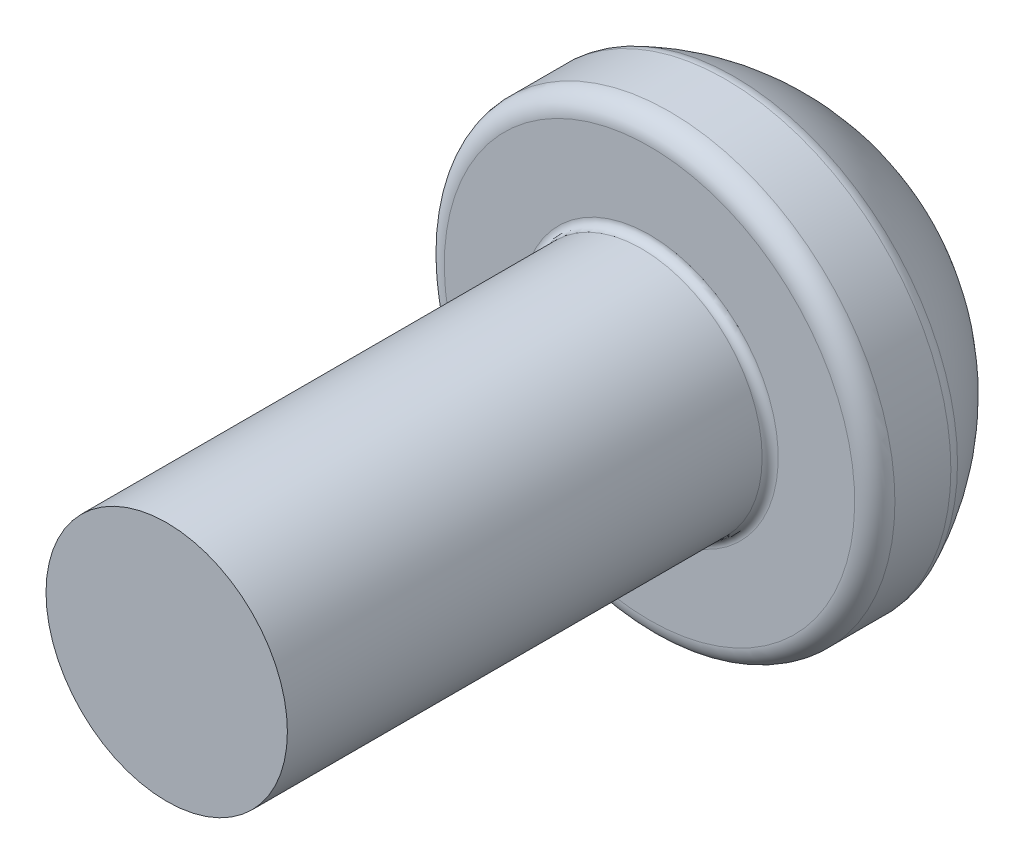
ISO-10303-21;
HEADER;
FILE_DESCRIPTION(('STEP AP214'),'2;1');
FILE_NAME('part.step','',(''),(''),'','','');
FILE_SCHEMA(('AUTOMOTIVE_DESIGN { 1 0 10303 214 1 1 1 1 }'));
ENDSEC;
DATA;
#1=APPLICATION_CONTEXT('core data for automotive mechanical design processes');
#2=APPLICATION_PROTOCOL_DEFINITION('international standard','automotive_design',2000,#1);
#3=PRODUCT_CONTEXT('',#1,'mechanical');
#4=PRODUCT('Part','Part','',(#3));
#5=PRODUCT_RELATED_PRODUCT_CATEGORY('part','',(#4));
#6=PRODUCT_DEFINITION_FORMATION('','',#4);
#7=PRODUCT_DEFINITION_CONTEXT('part definition',#1,'design');
#8=PRODUCT_DEFINITION('design','',#6,#7);
#9=PRODUCT_DEFINITION_SHAPE('','',#8);
#10=(LENGTH_UNIT() NAMED_UNIT(*) SI_UNIT(.MILLI.,.METRE.));
#11=(NAMED_UNIT(*) PLANE_ANGLE_UNIT() SI_UNIT($,.RADIAN.));
#12=(NAMED_UNIT(*) SI_UNIT($,.STERADIAN.) SOLID_ANGLE_UNIT());
#13=UNCERTAINTY_MEASURE_WITH_UNIT(LENGTH_MEASURE(1.E-05),#10,'distance_accuracy_value','');
#14=(GEOMETRIC_REPRESENTATION_CONTEXT(3) GLOBAL_UNCERTAINTY_ASSIGNED_CONTEXT((#13)) GLOBAL_UNIT_ASSIGNED_CONTEXT((#10,
#11,#12)) REPRESENTATION_CONTEXT('',''));
#15=CARTESIAN_POINT('',(0.,0.,0.));
#16=DIRECTION('',(0.,0.,1.));
#17=DIRECTION('',(1.,0.,0.));
#18=AXIS2_PLACEMENT_3D('',#15,#16,#17);
#19=CARTESIAN_POINT('',(0.,0.,6.));
#20=DIRECTION('',(0.,0.,1.));
#21=DIRECTION('',(0.,-1.,0.));
#22=AXIS2_PLACEMENT_3D('',#19,#20,#21);
#23=PLANE('',#22);
#24=CARTESIAN_POINT('',(0.,0.,6.));
#25=DIRECTION('',(0.,0.,-1.));
#26=DIRECTION('',(0.,1.,0.));
#27=AXIS2_PLACEMENT_3D('',#24,#25,#26);
#28=CIRCLE('',#27,1.5);
#29=CARTESIAN_POINT('',(0.,1.5,6.));
#30=VERTEX_POINT('',#29);
#31=EDGE_CURVE('E266',#30,#30,#28,.T.);
#32=ORIENTED_EDGE('',*,*,#31,.F.);
#33=EDGE_LOOP('',(#32));
#34=FACE_BOUND('',#33,.T.);
#35=ADVANCED_FACE('F34',(#34),#23,.T.);
#36=CARTESIAN_POINT('',(0.,0.,-2.4));
#37=DIRECTION('',(0.,0.,-1.));
#38=DIRECTION('',(0.,1.,0.));
#39=AXIS2_PLACEMENT_3D('',#36,#37,#38);
#40=CYLINDRICAL_SURFACE('',#39,1.5);
#41=CARTESIAN_POINT('',(0.,0.,0.0999999999999998));
#42=DIRECTION('',(0.,0.,1.));
#43=DIRECTION('',(0.,-1.,0.));
#44=AXIS2_PLACEMENT_3D('',#41,#42,#43);
#45=CIRCLE('',#44,1.5);
#46=CARTESIAN_POINT('',(0.,-1.5,0.0999999999999996));
#47=VERTEX_POINT('',#46);
#48=EDGE_CURVE('E272',#47,#47,#45,.T.);
#49=ORIENTED_EDGE('',*,*,#48,.T.);
#50=EDGE_LOOP('',(#49));
#51=FACE_BOUND('',#50,.T.);
#52=ORIENTED_EDGE('',*,*,#31,.T.);
#53=EDGE_LOOP('',(#52));
#54=FACE_BOUND('',#53,.T.);
#55=ADVANCED_FACE('F307',(#51,#54),#40,.T.);
#56=CARTESIAN_POINT('',(0.,1.5,0.));
#57=DIRECTION('',(0.,0.,1.));
#58=DIRECTION('',(0.,-1.,0.));
#59=AXIS2_PLACEMENT_3D('',#56,#57,#58);
#60=PLANE('',#59);
#61=CARTESIAN_POINT('',(0.,0.,0.));
#62=DIRECTION('',(0.,0.,1.));
#63=DIRECTION('',(0.,-1.,0.));
#64=AXIS2_PLACEMENT_3D('',#61,#62,#63);
#65=CIRCLE('',#64,2.55);
#66=CARTESIAN_POINT('',(0.,-2.55,0.));
#67=VERTEX_POINT('',#66);
#68=EDGE_CURVE('E11',#67,#67,#65,.T.);
#69=ORIENTED_EDGE('',*,*,#68,.T.);
#70=EDGE_LOOP('',(#69));
#71=FACE_BOUND('',#70,.T.);
#72=CARTESIAN_POINT('',(0.,0.,0.));
#73=DIRECTION('',(0.,0.,1.));
#74=DIRECTION('',(0.,-1.,0.));
#75=AXIS2_PLACEMENT_3D('',#72,#73,#74);
#76=CIRCLE('',#75,1.6);
#77=CARTESIAN_POINT('',(0.,-1.6,0.));
#78=VERTEX_POINT('',#77);
#79=EDGE_CURVE('E269',#78,#78,#76,.F.);
#80=ORIENTED_EDGE('',*,*,#79,.T.);
#81=EDGE_LOOP('',(#80));
#82=FACE_BOUND('',#81,.T.);
#83=ADVANCED_FACE('F312',(#71,#82),#60,.T.);
#84=CARTESIAN_POINT('',(0.,0.,-2.4));
#85=DIRECTION('',(0.,0.,-1.));
#86=DIRECTION('',(0.,1.,0.));
#87=AXIS2_PLACEMENT_3D('',#84,#85,#86);
#88=CYLINDRICAL_SURFACE('',#87,2.8);
#89=CARTESIAN_POINT('',(0.,0.,-0.945424841825026));
#90=DIRECTION('',(0.,0.,1.));
#91=DIRECTION('',(0.,-1.,0.));
#92=AXIS2_PLACEMENT_3D('',#89,#90,#91);
#93=CIRCLE('',#92,2.8);
#94=CARTESIAN_POINT('',(0.,-2.8,-0.945424841825027));
#95=VERTEX_POINT('',#94);
#96=EDGE_CURVE('E41',#95,#95,#93,.T.);
#97=ORIENTED_EDGE('',*,*,#96,.T.);
#98=EDGE_LOOP('',(#97));
#99=FACE_BOUND('',#98,.T.);
#100=CARTESIAN_POINT('',(0.,0.,-0.25));
#101=DIRECTION('',(0.,0.,1.));
#102=DIRECTION('',(0.,-1.,0.));
#103=AXIS2_PLACEMENT_3D('',#100,#101,#102);
#104=CIRCLE('',#103,2.8);
#105=CARTESIAN_POINT('',(0.,-2.8,-0.250000000000001));
#106=VERTEX_POINT('',#105);
#107=EDGE_CURVE('E278',#106,#106,#104,.F.);
#108=ORIENTED_EDGE('',*,*,#107,.T.);
#109=EDGE_LOOP('',(#108));
#110=FACE_BOUND('',#109,.T.);
#111=ADVANCED_FACE('F283',(#99,#110),#88,.T.);
#112=CARTESIAN_POINT('',(0.,0.,0.253));
#113=DIRECTION('',(0.,0.,-1.));
#114=DIRECTION('',(0.,1.,0.));
#115=AXIS2_PLACEMENT_3D('',#112,#113,#114);
#116=SPHERICAL_SURFACE('',#115,3.06757379699332);
#117=CARTESIAN_POINT('',(0.,0.,-1.05175966463463));
#118=DIRECTION('',(0.,0.,1.));
#119=DIRECTION('',(0.,-1.,0.));
#120=AXIS2_PLACEMENT_3D('',#117,#118,#119);
#121=CIRCLE('',#120,2.77625849256559);
#122=CARTESIAN_POINT('',(0.,2.77625849256559,-1.05175966463463));
#123=VERTEX_POINT('',#122);
#124=EDGE_CURVE('E275',#123,#123,#121,.F.);
#125=CARTESIAN_POINT('',(0.,0.,-2.4));
#126=DIRECTION('',(0.,0.,-1.));
#127=DIRECTION('',(0.,1.,0.));
#128=AXIS2_PLACEMENT_3D('',#125,#126,#127);
#129=CIRCLE('',#128,1.54);
#130=CARTESIAN_POINT('',(0.,1.54,-2.4));
#131=VERTEX_POINT('',#130);
#132=EDGE_CURVE('E262',#131,#131,#129,.T.);
#133=CARTESIAN_POINT('',(0.,2.77625849256559,-1.05175966463463));
#134=CARTESIAN_POINT('',(0.,2.76802873560929,-1.06927093928297));
#135=CARTESIAN_POINT('',(0.,2.7596332585651,-1.08670432952202));
#136=CARTESIAN_POINT('',(0.,2.74251396302794,-1.12140914487731));
#137=CARTESIAN_POINT('',(0.,2.73379014453496,-1.13868056999355));
#138=CARTESIAN_POINT('',(0.,2.71601726482717,-1.17305525879907));
#139=CARTESIAN_POINT('',(0.,2.70696820361237,-1.19015852248834));
#140=CARTESIAN_POINT('',(0.,2.68854808514226,-1.22419076788491));
#141=CARTESIAN_POINT('',(0.,2.67917702788695,-1.24111974959221));
#142=CARTESIAN_POINT('',(0.,2.66011627086747,-1.27479736870806));
#143=CARTESIAN_POINT('',(0.,2.6504265711033,-1.2915460061166));
#144=CARTESIAN_POINT('',(0.,2.63073199894964,-1.32485694000621));
#145=CARTESIAN_POINT('',(0.,2.62072712656015,-1.34141923648728));
#146=CARTESIAN_POINT('',(0.,2.60040579128121,-1.37435155831383));
#147=CARTESIAN_POINT('',(0.,2.59008932839177,-1.3907215836593));
#148=CARTESIAN_POINT('',(0.,2.56914850596593,-1.42326350192949));
#149=CARTESIAN_POINT('',(0.,2.55852414642954,-1.43943539485421));
#150=CARTESIAN_POINT('',(0.,2.53697133476196,-1.47157525791774));
#151=CARTESIAN_POINT('',(0.,2.52604288263078,-1.48754322805655));
#152=CARTESIAN_POINT('',(0.,2.50388579871807,-1.51926952820363));
#153=CARTESIAN_POINT('',(0.,2.49265716693654,-1.53502785821189));
#154=CARTESIAN_POINT('',(0.,2.46990374414404,-1.56632923581348));
#155=CARTESIAN_POINT('',(0.,2.45837895313307,-1.58187228340683));
#156=CARTESIAN_POINT('',(0.,2.43503733834351,-1.6127375309767));
#157=CARTESIAN_POINT('',(0.,2.42322051456492,-1.62805973095323));
#158=CARTESIAN_POINT('',(0.,2.39929906526431,-1.65847779716217));
#159=CARTESIAN_POINT('',(0.,2.38719443974229,-1.67357366339458));
#160=CARTESIAN_POINT('',(0.,2.36270172102674,-1.70353365702699));
#161=CARTESIAN_POINT('',(0.,2.3503136278332,-1.71839778442699));
#162=CARTESIAN_POINT('',(0.,2.32525840934237,-1.74788897828058));
#163=CARTESIAN_POINT('',(0.,2.31259128404507,-1.76251604473417));
#164=CARTESIAN_POINT('',(0.,2.28698253682217,-1.79152787946083));
#165=CARTESIAN_POINT('',(0.,2.27404091489656,-1.80591264773389));
#166=CARTESIAN_POINT('',(0.,2.24788780817623,-1.83443473562045));
#167=CARTESIAN_POINT('',(0.,2.23467632338151,-1.84857205523394));
#168=CARTESIAN_POINT('',(0.,2.20798822130683,-1.87659418392154));
#169=CARTESIAN_POINT('',(0.,2.19451160402685,-1.89047899299564));
#170=CARTESIAN_POINT('',(0.,2.16729806229642,-1.91799112913625));
#171=CARTESIAN_POINT('',(0.,2.15356113784596,-1.93161845620276));
#172=CARTESIAN_POINT('',(0.,2.12583190029255,-1.95861074905163));
#173=CARTESIAN_POINT('',(0.,2.11183958718959,-1.971975714834));
#174=CARTESIAN_POINT('',(0.,2.08360458229127,-1.99843849977674));
#175=CARTESIAN_POINT('',(0.,2.06936189049592,-2.0115363189371));
#176=CARTESIAN_POINT('',(0.,2.04063122782128,-2.03746012095011));
#177=CARTESIAN_POINT('',(0.,2.026143256942,-2.05028610380276));
#178=CARTESIAN_POINT('',(0.,1.99692722353021,-2.07566164084562));
#179=CARTESIAN_POINT('',(0.,1.98219916099771,-2.08821119503583));
#180=CARTESIAN_POINT('',(0.,1.95250821767573,-2.11302938137545));
#181=CARTESIAN_POINT('',(0.,1.93754533688625,-2.12529801352486));
#182=CARTESIAN_POINT('',(0.,1.90739011452162,-2.14954996298589));
#183=CARTESIAN_POINT('',(0.,1.89219777294648,-2.16153328029752));
#184=CARTESIAN_POINT('',(0.,1.86158906864721,-2.18521030945437));
#185=CARTESIAN_POINT('',(0.,1.84617270592309,-2.19690402129959));
#186=CARTESIAN_POINT('',(0.,1.81512147914839,-2.21999765254702));
#187=CARTESIAN_POINT('',(0.,1.79948661509781,-2.23139757194922));
#188=CARTESIAN_POINT('',(0.,1.76800398382114,-2.25389953668146));
#189=CARTESIAN_POINT('',(0.,1.75215621659505,-2.2650015820115));
#190=CARTESIAN_POINT('',(0.,1.72025345299826,-2.2869038230465));
#191=CARTESIAN_POINT('',(0.,1.70419845662755,-2.29770401875144));
#192=CARTESIAN_POINT('',(0.,1.67188698427808,-2.31899869521752));
#193=CARTESIAN_POINT('',(0.,1.65563050829932,-2.32949317597865));
#194=CARTESIAN_POINT('',(0.,1.62292189353214,-2.350172658651));
#195=CARTESIAN_POINT('',(0.,1.60646975474373,-2.36035766056221));
#196=CARTESIAN_POINT('',(0.,1.57337571941818,-2.38041456247664));
#197=CARTESIAN_POINT('',(0.,1.55673382288104,-2.39028646247984));
#198=CARTESIAN_POINT('',(0.,1.54,-2.4));
#199=B_SPLINE_CURVE_WITH_KNOTS('',3,(#133,#134,#135,#136,#137,#138,#139,#140,#141,#142,#143,
#144,#145,#146,#147,#148,#149,#150,#151,#152,#153,#154,#155,#156,#157,#158,#159,#160,#161,#162,
#163,#164,#165,#166,#167,#168,#169,#170,#171,#172,#173,#174,#175,#176,#177,#178,#179,#180,#181,
#182,#183,#184,#185,#186,#187,#188,#189,#190,#191,#192,#193,#194,#195,#196,#197,#198),
.UNSPECIFIED.,.F.,.F.,(4,2,2,2,2,2,2,2,2,2,2,2,2,2,2,2,2,2,2,2,2,2,2,2,2,2,2,2,2,2,2,2,4),(0.,
0.0580453449347516,0.116090689869503,0.174136034804255,0.232181379739007,0.290226724673758,
0.348272069608511,0.406317414543262,0.464362759478013,0.522408104412765,0.580453449347517,
0.638498794282268,0.69654413921702,0.754589484151772,0.812634829086524,0.870680174021275,
0.928725518956027,0.986770863890779,1.04481620882553,1.10286155376028,1.16090689869503,
1.21895224362979,1.27699758856454,1.33504293349929,1.39308827843404,1.45113362336879,
1.50917896830354,1.5672243132383,1.62526965817305,1.6833150031078,1.74136034804255,
1.7994056929773,1.85745103791205),.UNSPECIFIED.);
#200=EDGE_CURVE('BSEAM294',#123,#131,#199,.T.);
#201=ORIENTED_EDGE('',*,*,#124,.T.);
#202=ORIENTED_EDGE('',*,*,#132,.F.);
#203=ORIENTED_EDGE('',*,*,#200,.T.);
#204=ORIENTED_EDGE('',*,*,#200,.F.);
#205=EDGE_LOOP('',(#201,#203,#202,#204));
#206=FACE_BOUND('',#205,.T.);
#207=ADVANCED_FACE('F294',(#206),#116,.T.);
#208=CARTESIAN_POINT('',(0.,0.,-2.4));
#209=DIRECTION('',(0.,0.,-1.));
#210=DIRECTION('',(0.,1.,0.));
#211=AXIS2_PLACEMENT_3D('',#208,#209,#210);
#212=PLANE('',#211);
#213=CARTESIAN_POINT('',(0.,0.,-2.4));
#214=DIRECTION('',(0.,0.,-1.));
#215=DIRECTION('',(0.,1.,0.));
#216=AXIS2_PLACEMENT_3D('',#213,#214,#215);
#217=CIRCLE('',#216,1.4);
#218=CARTESIAN_POINT('',(0.217707917147366,-1.38296900283823,-2.4));
#219=VERTEX_POINT('',#218);
#220=CARTESIAN_POINT('',(-0.217707917147365,-1.38296900283823,-2.4));
#221=VERTEX_POINT('',#220);
#222=EDGE_CURVE('E185',#219,#221,#217,.T.);
#223=ORIENTED_EDGE('',*,*,#222,.F.);
#224=CARTESIAN_POINT('',(0.807500000000003,-1.39863102711187,-2.4));
#225=DIRECTION('',(0.,0.,1.));
#226=DIRECTION('',(0.,1.,0.));
#227=AXIS2_PLACEMENT_3D('',#224,#225,#226);
#228=CIRCLE('',#227,0.59);
#229=CARTESIAN_POINT('',(1.08883233053066,-0.880025088273724,-2.4));
#230=VERTEX_POINT('',#229);
#231=EDGE_CURVE('E183',#230,#219,#228,.T.);
#232=ORIENTED_EDGE('',*,*,#231,.F.);
#233=CARTESIAN_POINT('',(0.,0.,-2.4));
#234=DIRECTION('',(0.,0.,-1.));
#235=DIRECTION('',(0.,1.,0.));
#236=AXIS2_PLACEMENT_3D('',#233,#234,#235);
#237=CIRCLE('',#236,1.4);
#238=CARTESIAN_POINT('',(1.30654024767802,-0.502943914564499,-2.4));
#239=VERTEX_POINT('',#238);
#240=EDGE_CURVE('E180',#239,#230,#237,.T.);
#241=ORIENTED_EDGE('',*,*,#240,.F.);
#242=CARTESIAN_POINT('',(1.615,0.,-2.4));
#243=DIRECTION('',(0.,0.,1.));
#244=DIRECTION('',(0.,1.,0.));
#245=AXIS2_PLACEMENT_3D('',#242,#243,#244);
#246=CIRCLE('',#245,0.59);
#247=CARTESIAN_POINT('',(1.30654024767802,0.502943914564499,-2.4));
#248=VERTEX_POINT('',#247);
#249=EDGE_CURVE('E178',#248,#239,#246,.T.);
#250=ORIENTED_EDGE('',*,*,#249,.F.);
#251=CARTESIAN_POINT('',(0.,0.,-2.4));
#252=DIRECTION('',(0.,0.,-1.));
#253=DIRECTION('',(0.,1.,0.));
#254=AXIS2_PLACEMENT_3D('',#251,#252,#253);
#255=CIRCLE('',#254,1.4);
#256=CARTESIAN_POINT('',(1.08883233053065,0.880025088273735,-2.4));
#257=VERTEX_POINT('',#256);
#258=EDGE_CURVE('E175',#257,#248,#255,.T.);
#259=ORIENTED_EDGE('',*,*,#258,.F.);
#260=CARTESIAN_POINT('',(0.80749999999999,1.39863102711187,-2.4));
#261=DIRECTION('',(0.,0.,1.));
#262=DIRECTION('',(0.,1.,0.));
#263=AXIS2_PLACEMENT_3D('',#260,#261,#262);
#264=CIRCLE('',#263,0.59);
#265=CARTESIAN_POINT('',(0.217707917147353,1.38296900283823,-2.4));
#266=VERTEX_POINT('',#265);
#267=EDGE_CURVE('E170',#266,#257,#264,.T.);
#268=ORIENTED_EDGE('',*,*,#267,.F.);
#269=CARTESIAN_POINT('',(0.,0.,-2.4));
#270=DIRECTION('',(0.,0.,-1.));
#271=DIRECTION('',(0.,1.,0.));
#272=AXIS2_PLACEMENT_3D('',#269,#270,#271);
#273=CIRCLE('',#272,1.4);
#274=CARTESIAN_POINT('',(-0.217707917147376,1.38296900283822,-2.4));
#275=VERTEX_POINT('',#274);
#276=EDGE_CURVE('E168',#275,#266,#273,.T.);
#277=ORIENTED_EDGE('',*,*,#276,.F.);
#278=CARTESIAN_POINT('',(-0.807500000000012,1.39863102711186,-2.4));
#279=DIRECTION('',(0.,0.,1.));
#280=DIRECTION('',(0.,1.,0.));
#281=AXIS2_PLACEMENT_3D('',#278,#279,#280);
#282=CIRCLE('',#281,0.59);
#283=CARTESIAN_POINT('',(-1.08883233053066,0.880025088273718,-2.4));
#284=VERTEX_POINT('',#283);
#285=EDGE_CURVE('E149',#284,#275,#282,.T.);
#286=ORIENTED_EDGE('',*,*,#285,.F.);
#287=CARTESIAN_POINT('',(0.,0.,-2.4));
#288=DIRECTION('',(0.,0.,-1.));
#289=DIRECTION('',(0.,1.,0.));
#290=AXIS2_PLACEMENT_3D('',#287,#288,#289);
#291=CIRCLE('',#290,1.4);
#292=CARTESIAN_POINT('',(-1.30654024767802,0.502943914564499,-2.4));
#293=VERTEX_POINT('',#292);
#294=EDGE_CURVE('E158',#293,#284,#291,.T.);
#295=ORIENTED_EDGE('',*,*,#294,.F.);
#296=CARTESIAN_POINT('',(-1.615,0.,-2.4));
#297=DIRECTION('',(0.,0.,1.));
#298=DIRECTION('',(0.,1.,0.));
#299=AXIS2_PLACEMENT_3D('',#296,#297,#298);
#300=CIRCLE('',#299,0.59);
#301=CARTESIAN_POINT('',(-1.30654024767802,-0.502943914564499,-2.4));
#302=VERTEX_POINT('',#301);
#303=EDGE_CURVE('E161',#302,#293,#300,.T.);
#304=ORIENTED_EDGE('',*,*,#303,.F.);
#305=CARTESIAN_POINT('',(0.,0.,-2.4));
#306=DIRECTION('',(0.,0.,-1.));
#307=DIRECTION('',(0.,1.,0.));
#308=AXIS2_PLACEMENT_3D('',#305,#306,#307);
#309=CIRCLE('',#308,1.4);
#310=CARTESIAN_POINT('',(-1.08883233053066,-0.880025088273725,-2.4));
#311=VERTEX_POINT('',#310);
#312=EDGE_CURVE('E190',#311,#302,#309,.T.);
#313=ORIENTED_EDGE('',*,*,#312,.F.);
#314=CARTESIAN_POINT('',(-0.807500000000002,-1.39863102711187,-2.4));
#315=DIRECTION('',(0.,0.,1.));
#316=DIRECTION('',(0.,1.,0.));
#317=AXIS2_PLACEMENT_3D('',#314,#315,#316);
#318=CIRCLE('',#317,0.59);
#319=EDGE_CURVE('E188',#221,#311,#318,.T.);
#320=ORIENTED_EDGE('',*,*,#319,.F.);
#321=EDGE_LOOP('',(#223,#232,#241,#250,#259,#268,#277,#286,#295,#304,#313,#320));
#322=FACE_BOUND('',#321,.T.);
#323=ORIENTED_EDGE('',*,*,#132,.T.);
#324=EDGE_LOOP('',(#323));
#325=FACE_BOUND('',#324,.T.);
#326=ADVANCED_FACE('F165',(#322,#325),#212,.T.);
#327=CARTESIAN_POINT('',(0.,0.,0.0999999999999998));
#328=DIRECTION('',(0.,0.,1.));
#329=DIRECTION('',(0.,-1.,0.));
#330=AXIS2_PLACEMENT_3D('',#327,#328,#329);
#331=TOROIDAL_SURFACE('',#330,1.6,0.1);
#332=ORIENTED_EDGE('',*,*,#48,.F.);
#333=EDGE_LOOP('',(#332));
#334=FACE_BOUND('',#333,.T.);
#335=ORIENTED_EDGE('',*,*,#79,.F.);
#336=EDGE_LOOP('',(#335));
#337=FACE_BOUND('',#336,.T.);
#338=ADVANCED_FACE('F290',(#334,#337),#331,.F.);
#339=CARTESIAN_POINT('',(0.,0.,-0.945424841825026));
#340=DIRECTION('',(0.,0.,1.));
#341=DIRECTION('',(0.,-1.,0.));
#342=AXIS2_PLACEMENT_3D('',#339,#340,#341);
#343=TOROIDAL_SURFACE('',#342,2.55,0.25);
#344=ORIENTED_EDGE('',*,*,#96,.F.);
#345=EDGE_LOOP('',(#344));
#346=FACE_BOUND('',#345,.T.);
#347=ORIENTED_EDGE('',*,*,#124,.F.);
#348=EDGE_LOOP('',(#347));
#349=FACE_BOUND('',#348,.T.);
#350=ADVANCED_FACE('F286',(#346,#349),#343,.T.);
#351=CARTESIAN_POINT('',(0.,0.,-0.25));
#352=DIRECTION('',(0.,0.,1.));
#353=DIRECTION('',(0.,-1.,0.));
#354=AXIS2_PLACEMENT_3D('',#351,#352,#353);
#355=TOROIDAL_SURFACE('',#354,2.55,0.25);
#356=ORIENTED_EDGE('',*,*,#68,.F.);
#357=EDGE_LOOP('',(#356));
#358=FACE_BOUND('',#357,.T.);
#359=ORIENTED_EDGE('',*,*,#107,.F.);
#360=EDGE_LOOP('',(#359));
#361=FACE_BOUND('',#360,.T.);
#362=ADVANCED_FACE('F289',(#358,#361),#355,.T.);
#363=CARTESIAN_POINT('',(-1.615,0.,-1.4));
#364=DIRECTION('',(0.,0.,-1.));
#365=DIRECTION('',(0.,1.,0.));
#366=AXIS2_PLACEMENT_3D('',#363,#364,#365);
#367=CYLINDRICAL_SURFACE('',#366,0.59);
#368=CARTESIAN_POINT('',(-1.615,0.,-1.4));
#369=DIRECTION('',(0.,0.,1.));
#370=DIRECTION('',(0.,1.,0.));
#371=AXIS2_PLACEMENT_3D('',#368,#369,#370);
#372=CIRCLE('',#371,0.59);
#373=CARTESIAN_POINT('',(-1.30654024767802,-0.502943914564499,-1.4));
#374=VERTEX_POINT('',#373);
#375=CARTESIAN_POINT('',(-1.025,0.,-1.4));
#376=VERTEX_POINT('',#375);
#377=EDGE_CURVE('E194',#374,#376,#372,.T.);
#378=ORIENTED_EDGE('',*,*,#377,.F.);
#379=DIRECTION('',(0.,0.,-1.));
#380=VECTOR('',#379,1.);
#381=CARTESIAN_POINT('',(-1.30654024767802,-0.502943914564499,-1.4));
#382=LINE('',#381,#380);
#383=EDGE_CURVE('E229',#374,#302,#382,.T.);
#384=ORIENTED_EDGE('',*,*,#383,.T.);
#385=ORIENTED_EDGE('',*,*,#303,.T.);
#386=DIRECTION('',(0.,0.,-1.));
#387=VECTOR('',#386,1.);
#388=CARTESIAN_POINT('',(-1.30654024767802,0.502943914564499,-1.4));
#389=LINE('',#388,#387);
#390=CARTESIAN_POINT('',(-1.30654024767802,0.502943914564499,-1.4));
#391=VERTEX_POINT('',#390);
#392=EDGE_CURVE('E48',#391,#293,#389,.T.);
#393=ORIENTED_EDGE('',*,*,#392,.F.);
#394=EDGE_CURVE('E193',#376,#391,#372,.T.);
#395=ORIENTED_EDGE('',*,*,#394,.F.);
#396=EDGE_LOOP('',(#378,#384,#385,#393,#395));
#397=FACE_BOUND('',#396,.T.);
#398=ADVANCED_FACE('F347',(#397),#367,.T.);
#399=CARTESIAN_POINT('',(-0.807500000000002,-1.39863102711187,-1.4));
#400=DIRECTION('',(0.,0.,-1.));
#401=DIRECTION('',(0.,1.,0.));
#402=AXIS2_PLACEMENT_3D('',#399,#400,#401);
#403=CYLINDRICAL_SURFACE('',#402,0.59);
#404=CARTESIAN_POINT('',(-0.807500000000002,-1.39863102711187,-1.4));
#405=DIRECTION('',(0.,0.,1.));
#406=DIRECTION('',(0.,1.,0.));
#407=AXIS2_PLACEMENT_3D('',#404,#405,#406);
#408=CIRCLE('',#407,0.59);
#409=CARTESIAN_POINT('',(-0.217707917147365,-1.38296900283823,-1.4));
#410=VERTEX_POINT('',#409);
#411=CARTESIAN_POINT('',(-0.512500000000001,-0.887676038879049,-1.4));
#412=VERTEX_POINT('',#411);
#413=EDGE_CURVE('E223',#410,#412,#408,.T.);
#414=ORIENTED_EDGE('',*,*,#413,.F.);
#415=DIRECTION('',(0.,0.,-1.));
#416=VECTOR('',#415,1.);
#417=CARTESIAN_POINT('',(-0.217707917147365,-1.38296900283823,-1.4));
#418=LINE('',#417,#416);
#419=EDGE_CURVE('E236',#410,#221,#418,.T.);
#420=ORIENTED_EDGE('',*,*,#419,.T.);
#421=ORIENTED_EDGE('',*,*,#319,.T.);
#422=DIRECTION('',(0.,0.,-1.));
#423=VECTOR('',#422,1.);
#424=CARTESIAN_POINT('',(-1.08883233053066,-0.880025088273725,-1.4));
#425=LINE('',#424,#423);
#426=CARTESIAN_POINT('',(-1.08883233053066,-0.880025088273725,-1.4));
#427=VERTEX_POINT('',#426);
#428=EDGE_CURVE('E233',#427,#311,#425,.T.);
#429=ORIENTED_EDGE('',*,*,#428,.F.);
#430=EDGE_CURVE('E222',#412,#427,#408,.T.);
#431=ORIENTED_EDGE('',*,*,#430,.F.);
#432=EDGE_LOOP('',(#414,#420,#421,#429,#431));
#433=FACE_BOUND('',#432,.T.);
#434=ADVANCED_FACE('F362',(#433),#403,.T.);
#435=CARTESIAN_POINT('',(0.807500000000003,-1.39863102711187,-1.4));
#436=DIRECTION('',(0.,0.,-1.));
#437=DIRECTION('',(0.,1.,0.));
#438=AXIS2_PLACEMENT_3D('',#435,#436,#437);
#439=CYLINDRICAL_SURFACE('',#438,0.59);
#440=CARTESIAN_POINT('',(0.807500000000003,-1.39863102711187,-1.4));
#441=DIRECTION('',(0.,0.,1.));
#442=DIRECTION('',(0.,1.,0.));
#443=AXIS2_PLACEMENT_3D('',#440,#441,#442);
#444=CIRCLE('',#443,0.59);
#445=CARTESIAN_POINT('',(1.08883233053066,-0.880025088273725,-1.4));
#446=VERTEX_POINT('',#445);
#447=CARTESIAN_POINT('',(0.512500000000002,-0.887676038879048,-1.4));
#448=VERTEX_POINT('',#447);
#449=EDGE_CURVE('E216',#446,#448,#444,.T.);
#450=ORIENTED_EDGE('',*,*,#449,.F.);
#451=DIRECTION('',(0.,0.,-1.));
#452=VECTOR('',#451,1.);
#453=CARTESIAN_POINT('',(1.08883233053066,-0.880025088273725,-1.4));
#454=LINE('',#453,#452);
#455=EDGE_CURVE('E242',#446,#230,#454,.T.);
#456=ORIENTED_EDGE('',*,*,#455,.T.);
#457=ORIENTED_EDGE('',*,*,#231,.T.);
#458=DIRECTION('',(0.,0.,-1.));
#459=VECTOR('',#458,1.);
#460=CARTESIAN_POINT('',(0.217707917147366,-1.38296900283823,-1.4));
#461=LINE('',#460,#459);
#462=CARTESIAN_POINT('',(0.217707917147366,-1.38296900283823,-1.4));
#463=VERTEX_POINT('',#462);
#464=EDGE_CURVE('E239',#463,#219,#461,.T.);
#465=ORIENTED_EDGE('',*,*,#464,.F.);
#466=EDGE_CURVE('E215',#448,#463,#444,.T.);
#467=ORIENTED_EDGE('',*,*,#466,.F.);
#468=EDGE_LOOP('',(#450,#456,#457,#465,#467));
#469=FACE_BOUND('',#468,.T.);
#470=ADVANCED_FACE('F372',(#469),#439,.T.);
#471=CARTESIAN_POINT('',(1.615,0.,-1.4));
#472=DIRECTION('',(0.,0.,-1.));
#473=DIRECTION('',(0.,1.,0.));
#474=AXIS2_PLACEMENT_3D('',#471,#472,#473);
#475=CYLINDRICAL_SURFACE('',#474,0.59);
#476=CARTESIAN_POINT('',(1.615,0.,-1.4));
#477=DIRECTION('',(0.,0.,1.));
#478=DIRECTION('',(0.,1.,0.));
#479=AXIS2_PLACEMENT_3D('',#476,#477,#478);
#480=CIRCLE('',#479,0.59);
#481=CARTESIAN_POINT('',(1.30654024767802,0.502943914564499,-1.4));
#482=VERTEX_POINT('',#481);
#483=CARTESIAN_POINT('',(1.025,0.,-1.4));
#484=VERTEX_POINT('',#483);
#485=EDGE_CURVE('E209',#482,#484,#480,.T.);
#486=ORIENTED_EDGE('',*,*,#485,.F.);
#487=DIRECTION('',(0.,0.,-1.));
#488=VECTOR('',#487,1.);
#489=CARTESIAN_POINT('',(1.30654024767802,0.502943914564499,-1.4));
#490=LINE('',#489,#488);
#491=EDGE_CURVE('E248',#482,#248,#490,.T.);
#492=ORIENTED_EDGE('',*,*,#491,.T.);
#493=ORIENTED_EDGE('',*,*,#249,.T.);
#494=DIRECTION('',(0.,0.,-1.));
#495=VECTOR('',#494,1.);
#496=CARTESIAN_POINT('',(1.30654024767802,-0.502943914564499,-1.4));
#497=LINE('',#496,#495);
#498=CARTESIAN_POINT('',(1.30654024767802,-0.502943914564499,-1.4));
#499=VERTEX_POINT('',#498);
#500=EDGE_CURVE('E245',#499,#239,#497,.T.);
#501=ORIENTED_EDGE('',*,*,#500,.F.);
#502=EDGE_CURVE('E208',#484,#499,#480,.T.);
#503=ORIENTED_EDGE('',*,*,#502,.F.);
#504=EDGE_LOOP('',(#486,#492,#493,#501,#503));
#505=FACE_BOUND('',#504,.T.);
#506=ADVANCED_FACE('F382',(#505),#475,.T.);
#507=CARTESIAN_POINT('',(0.80749999999999,1.39863102711187,-1.4));
#508=DIRECTION('',(0.,0.,-1.));
#509=DIRECTION('',(0.,1.,0.));
#510=AXIS2_PLACEMENT_3D('',#507,#508,#509);
#511=CYLINDRICAL_SURFACE('',#510,0.59);
#512=CARTESIAN_POINT('',(0.80749999999999,1.39863102711187,-1.4));
#513=DIRECTION('',(0.,0.,1.));
#514=DIRECTION('',(0.,1.,0.));
#515=AXIS2_PLACEMENT_3D('',#512,#513,#514);
#516=CIRCLE('',#515,0.59);
#517=CARTESIAN_POINT('',(0.217707917147353,1.38296900283823,-1.4));
#518=VERTEX_POINT('',#517);
#519=CARTESIAN_POINT('',(0.512499999999994,0.887676038879053,-1.4));
#520=VERTEX_POINT('',#519);
#521=EDGE_CURVE('E56',#518,#520,#516,.T.);
#522=ORIENTED_EDGE('',*,*,#521,.F.);
#523=DIRECTION('',(0.,0.,-1.));
#524=VECTOR('',#523,1.);
#525=CARTESIAN_POINT('',(0.217707917147353,1.38296900283823,-1.4));
#526=LINE('',#525,#524);
#527=EDGE_CURVE('E254',#518,#266,#526,.T.);
#528=ORIENTED_EDGE('',*,*,#527,.T.);
#529=ORIENTED_EDGE('',*,*,#267,.T.);
#530=DIRECTION('',(0.,0.,-1.));
#531=VECTOR('',#530,1.);
#532=CARTESIAN_POINT('',(1.08883233053065,0.880025088273735,-1.4));
#533=LINE('',#532,#531);
#534=CARTESIAN_POINT('',(1.08883233053065,0.880025088273735,-1.4));
#535=VERTEX_POINT('',#534);
#536=EDGE_CURVE('E251',#535,#257,#533,.T.);
#537=ORIENTED_EDGE('',*,*,#536,.F.);
#538=EDGE_CURVE('E203',#520,#535,#516,.T.);
#539=ORIENTED_EDGE('',*,*,#538,.F.);
#540=EDGE_LOOP('',(#522,#528,#529,#537,#539));
#541=FACE_BOUND('',#540,.T.);
#542=ADVANCED_FACE('F392',(#541),#511,.T.);
#543=CARTESIAN_POINT('',(-0.807500000000012,1.39863102711186,-1.4));
#544=DIRECTION('',(0.,0.,-1.));
#545=DIRECTION('',(0.,1.,0.));
#546=AXIS2_PLACEMENT_3D('',#543,#544,#545);
#547=CYLINDRICAL_SURFACE('',#546,0.59);
#548=CARTESIAN_POINT('',(-0.807500000000012,1.39863102711186,-1.4));
#549=DIRECTION('',(0.,0.,1.));
#550=DIRECTION('',(0.,1.,0.));
#551=AXIS2_PLACEMENT_3D('',#548,#549,#550);
#552=CIRCLE('',#551,0.59);
#553=CARTESIAN_POINT('',(-1.08883233053066,0.880025088273718,-1.4));
#554=VERTEX_POINT('',#553);
#555=CARTESIAN_POINT('',(-0.512500000000008,0.887676038879045,-1.4));
#556=VERTEX_POINT('',#555);
#557=EDGE_CURVE('E153',#554,#556,#552,.T.);
#558=ORIENTED_EDGE('',*,*,#557,.F.);
#559=DIRECTION('',(0.,0.,-1.));
#560=VECTOR('',#559,1.);
#561=CARTESIAN_POINT('',(-1.08883233053066,0.880025088273718,-1.4));
#562=LINE('',#561,#560);
#563=EDGE_CURVE('E145',#554,#284,#562,.T.);
#564=ORIENTED_EDGE('',*,*,#563,.T.);
#565=ORIENTED_EDGE('',*,*,#285,.T.);
#566=DIRECTION('',(0.,0.,-1.));
#567=VECTOR('',#566,1.);
#568=CARTESIAN_POINT('',(-0.217707917147376,1.38296900283822,-1.4));
#569=LINE('',#568,#567);
#570=CARTESIAN_POINT('',(-0.217707917147376,1.38296900283822,-1.4));
#571=VERTEX_POINT('',#570);
#572=EDGE_CURVE('E155',#571,#275,#569,.T.);
#573=ORIENTED_EDGE('',*,*,#572,.F.);
#574=EDGE_CURVE('E199',#556,#571,#552,.T.);
#575=ORIENTED_EDGE('',*,*,#574,.F.);
#576=EDGE_LOOP('',(#558,#564,#565,#573,#575));
#577=FACE_BOUND('',#576,.T.);
#578=ADVANCED_FACE('F146',(#577),#547,.T.);
#579=CARTESIAN_POINT('',(-0.8075,0.,-1.4));
#580=DIRECTION('',(0.,0.,-1.));
#581=DIRECTION('',(0.,1.,0.));
#582=AXIS2_PLACEMENT_3D('',#579,#580,#581);
#583=PLANE('',#582);
#584=CARTESIAN_POINT('',(0.,0.,-1.4));
#585=DIRECTION('',(0.,0.,-1.));
#586=DIRECTION('',(0.,1.,0.));
#587=AXIS2_PLACEMENT_3D('',#584,#585,#586);
#588=CIRCLE('',#587,1.025);
#589=EDGE_CURVE('E551',#376,#556,#588,.T.);
#590=ORIENTED_EDGE('',*,*,#589,.F.);
#591=ORIENTED_EDGE('',*,*,#394,.T.);
#592=CARTESIAN_POINT('',(0.,0.,-1.4));
#593=DIRECTION('',(0.,0.,-1.));
#594=DIRECTION('',(0.,1.,0.));
#595=AXIS2_PLACEMENT_3D('',#592,#593,#594);
#596=CIRCLE('',#595,1.4);
#597=EDGE_CURVE('E197',#391,#554,#596,.T.);
#598=ORIENTED_EDGE('',*,*,#597,.T.);
#599=ORIENTED_EDGE('',*,*,#557,.T.);
#600=EDGE_LOOP('',(#590,#591,#598,#599));
#601=FACE_BOUND('',#600,.T.);
#602=ADVANCED_FACE('F411',(#601),#583,.T.);
#603=EDGE_CURVE('E549',#412,#376,#588,.T.);
#604=ORIENTED_EDGE('',*,*,#603,.F.);
#605=ORIENTED_EDGE('',*,*,#430,.T.);
#606=CARTESIAN_POINT('',(0.,0.,-1.4));
#607=DIRECTION('',(0.,0.,-1.));
#608=DIRECTION('',(0.,1.,0.));
#609=AXIS2_PLACEMENT_3D('',#606,#607,#608);
#610=CIRCLE('',#609,1.4);
#611=EDGE_CURVE('E226',#427,#374,#610,.T.);
#612=ORIENTED_EDGE('',*,*,#611,.T.);
#613=ORIENTED_EDGE('',*,*,#377,.T.);
#614=EDGE_LOOP('',(#604,#605,#612,#613));
#615=FACE_BOUND('',#614,.T.);
#616=ADVANCED_FACE('F420',(#615),#583,.T.);
#617=EDGE_CURVE('E548',#448,#412,#588,.T.);
#618=ORIENTED_EDGE('',*,*,#617,.F.);
#619=ORIENTED_EDGE('',*,*,#466,.T.);
#620=CARTESIAN_POINT('',(0.,0.,-1.4));
#621=DIRECTION('',(0.,0.,-1.));
#622=DIRECTION('',(0.,1.,0.));
#623=AXIS2_PLACEMENT_3D('',#620,#621,#622);
#624=CIRCLE('',#623,1.4);
#625=EDGE_CURVE('E219',#463,#410,#624,.T.);
#626=ORIENTED_EDGE('',*,*,#625,.T.);
#627=ORIENTED_EDGE('',*,*,#413,.T.);
#628=EDGE_LOOP('',(#618,#619,#626,#627));
#629=FACE_BOUND('',#628,.T.);
#630=ADVANCED_FACE('F431',(#629),#583,.T.);
#631=EDGE_CURVE('E263',#484,#448,#588,.T.);
#632=ORIENTED_EDGE('',*,*,#631,.F.);
#633=ORIENTED_EDGE('',*,*,#502,.T.);
#634=CARTESIAN_POINT('',(0.,0.,-1.4));
#635=DIRECTION('',(0.,0.,-1.));
#636=DIRECTION('',(0.,1.,0.));
#637=AXIS2_PLACEMENT_3D('',#634,#635,#636);
#638=CIRCLE('',#637,1.4);
#639=EDGE_CURVE('E212',#499,#446,#638,.T.);
#640=ORIENTED_EDGE('',*,*,#639,.T.);
#641=ORIENTED_EDGE('',*,*,#449,.T.);
#642=EDGE_LOOP('',(#632,#633,#640,#641));
#643=FACE_BOUND('',#642,.T.);
#644=ADVANCED_FACE('F440',(#643),#583,.T.);
#645=EDGE_CURVE('E259',#520,#484,#588,.T.);
#646=ORIENTED_EDGE('',*,*,#645,.F.);
#647=ORIENTED_EDGE('',*,*,#538,.T.);
#648=CARTESIAN_POINT('',(0.,0.,-1.4));
#649=DIRECTION('',(0.,0.,-1.));
#650=DIRECTION('',(0.,1.,0.));
#651=AXIS2_PLACEMENT_3D('',#648,#649,#650);
#652=CIRCLE('',#651,1.4);
#653=EDGE_CURVE('E205',#535,#482,#652,.T.);
#654=ORIENTED_EDGE('',*,*,#653,.T.);
#655=ORIENTED_EDGE('',*,*,#485,.T.);
#656=EDGE_LOOP('',(#646,#647,#654,#655));
#657=FACE_BOUND('',#656,.T.);
#658=ADVANCED_FACE('F449',(#657),#583,.T.);
#659=EDGE_CURVE('E232',#556,#520,#588,.T.);
#660=ORIENTED_EDGE('',*,*,#659,.F.);
#661=ORIENTED_EDGE('',*,*,#574,.T.);
#662=CARTESIAN_POINT('',(0.,0.,-1.4));
#663=DIRECTION('',(0.,0.,-1.));
#664=DIRECTION('',(0.,1.,0.));
#665=AXIS2_PLACEMENT_3D('',#662,#663,#664);
#666=CIRCLE('',#665,1.4);
#667=EDGE_CURVE('E201',#571,#518,#666,.T.);
#668=ORIENTED_EDGE('',*,*,#667,.T.);
#669=ORIENTED_EDGE('',*,*,#521,.T.);
#670=EDGE_LOOP('',(#660,#661,#668,#669));
#671=FACE_BOUND('',#670,.T.);
#672=ADVANCED_FACE('F423',(#671),#583,.T.);
#673=CARTESIAN_POINT('',(0.,0.,-1.4));
#674=DIRECTION('',(0.,0.,-1.));
#675=DIRECTION('',(0.,1.,0.));
#676=AXIS2_PLACEMENT_3D('',#673,#674,#675);
#677=CYLINDRICAL_SURFACE('',#676,1.4);
#678=ORIENTED_EDGE('',*,*,#312,.T.);
#679=ORIENTED_EDGE('',*,*,#383,.F.);
#680=ORIENTED_EDGE('',*,*,#611,.F.);
#681=ORIENTED_EDGE('',*,*,#428,.T.);
#682=EDGE_LOOP('',(#678,#679,#680,#681));
#683=FACE_BOUND('',#682,.T.);
#684=ADVANCED_FACE('F466',(#683),#677,.F.);
#685=CARTESIAN_POINT('',(0.,0.,-1.4));
#686=DIRECTION('',(0.,0.,-1.));
#687=DIRECTION('',(0.,1.,0.));
#688=AXIS2_PLACEMENT_3D('',#685,#686,#687);
#689=CYLINDRICAL_SURFACE('',#688,1.4);
#690=ORIENTED_EDGE('',*,*,#222,.T.);
#691=ORIENTED_EDGE('',*,*,#419,.F.);
#692=ORIENTED_EDGE('',*,*,#625,.F.);
#693=ORIENTED_EDGE('',*,*,#464,.T.);
#694=EDGE_LOOP('',(#690,#691,#692,#693));
#695=FACE_BOUND('',#694,.T.);
#696=ADVANCED_FACE('F474',(#695),#689,.F.);
#697=CARTESIAN_POINT('',(0.,0.,-1.4));
#698=DIRECTION('',(0.,0.,-1.));
#699=DIRECTION('',(0.,1.,0.));
#700=AXIS2_PLACEMENT_3D('',#697,#698,#699);
#701=CYLINDRICAL_SURFACE('',#700,1.4);
#702=ORIENTED_EDGE('',*,*,#240,.T.);
#703=ORIENTED_EDGE('',*,*,#455,.F.);
#704=ORIENTED_EDGE('',*,*,#639,.F.);
#705=ORIENTED_EDGE('',*,*,#500,.T.);
#706=EDGE_LOOP('',(#702,#703,#704,#705));
#707=FACE_BOUND('',#706,.T.);
#708=ADVANCED_FACE('F484',(#707),#701,.F.);
#709=CARTESIAN_POINT('',(0.,0.,-1.4));
#710=DIRECTION('',(0.,0.,-1.));
#711=DIRECTION('',(0.,1.,0.));
#712=AXIS2_PLACEMENT_3D('',#709,#710,#711);
#713=CYLINDRICAL_SURFACE('',#712,1.4);
#714=ORIENTED_EDGE('',*,*,#258,.T.);
#715=ORIENTED_EDGE('',*,*,#491,.F.);
#716=ORIENTED_EDGE('',*,*,#653,.F.);
#717=ORIENTED_EDGE('',*,*,#536,.T.);
#718=EDGE_LOOP('',(#714,#715,#716,#717));
#719=FACE_BOUND('',#718,.T.);
#720=ADVANCED_FACE('F494',(#719),#713,.F.);
#721=CARTESIAN_POINT('',(0.,0.,-1.4));
#722=DIRECTION('',(0.,0.,-1.));
#723=DIRECTION('',(0.,1.,0.));
#724=AXIS2_PLACEMENT_3D('',#721,#722,#723);
#725=CYLINDRICAL_SURFACE('',#724,1.4);
#726=ORIENTED_EDGE('',*,*,#276,.T.);
#727=ORIENTED_EDGE('',*,*,#527,.F.);
#728=ORIENTED_EDGE('',*,*,#667,.F.);
#729=ORIENTED_EDGE('',*,*,#572,.T.);
#730=EDGE_LOOP('',(#726,#727,#728,#729));
#731=FACE_BOUND('',#730,.T.);
#732=ADVANCED_FACE('F504',(#731),#725,.F.);
#733=CARTESIAN_POINT('',(0.,0.,-1.4));
#734=DIRECTION('',(0.,0.,-1.));
#735=DIRECTION('',(0.,1.,0.));
#736=AXIS2_PLACEMENT_3D('',#733,#734,#735);
#737=CYLINDRICAL_SURFACE('',#736,1.4);
#738=ORIENTED_EDGE('',*,*,#294,.T.);
#739=ORIENTED_EDGE('',*,*,#563,.F.);
#740=ORIENTED_EDGE('',*,*,#597,.F.);
#741=ORIENTED_EDGE('',*,*,#392,.T.);
#742=EDGE_LOOP('',(#738,#739,#740,#741));
#743=FACE_BOUND('',#742,.T.);
#744=ADVANCED_FACE('F159',(#743),#737,.F.);
#745=CARTESIAN_POINT('',(0.,0.,-1.4));
#746=DIRECTION('',(0.,0.,-1.));
#747=DIRECTION('',(0.,1.,0.));
#748=AXIS2_PLACEMENT_3D('',#745,#746,#747);
#749=CONICAL_SURFACE('',#748,1.025,1.22173047639603);
#750=CARTESIAN_POINT('',(0.,0.,-1.02693050987715));
#751=VERTEX_POINT('',#750);
#752=VERTEX_LOOP('',#751);
#753=FACE_BOUND('',#752,.T.);
#754=ORIENTED_EDGE('',*,*,#645,.T.);
#755=ORIENTED_EDGE('',*,*,#631,.T.);
#756=ORIENTED_EDGE('',*,*,#617,.T.);
#757=ORIENTED_EDGE('',*,*,#603,.T.);
#758=ORIENTED_EDGE('',*,*,#589,.T.);
#759=ORIENTED_EDGE('',*,*,#659,.T.);
#760=EDGE_LOOP('',(#754,#755,#756,#757,#758,#759));
#761=FACE_BOUND('',#760,.T.);
#762=ADVANCED_FACE('F523',(#753,#761),#749,.F.);
#763=CLOSED_SHELL('',(#35,#55,#83,#111,#207,#326,#338,#350,#362,#398,#434,#470,#506,#542,#578,
#602,#616,#630,#644,#658,#672,#684,#696,#708,#720,#732,#744,#762));
#764=MANIFOLD_SOLID_BREP('B2',#763);
#765=ADVANCED_BREP_SHAPE_REPRESENTATION('',(#18,#764),#14);
#766=SHAPE_DEFINITION_REPRESENTATION(#9,#765);
ENDSEC;
END-ISO-10303-21;
